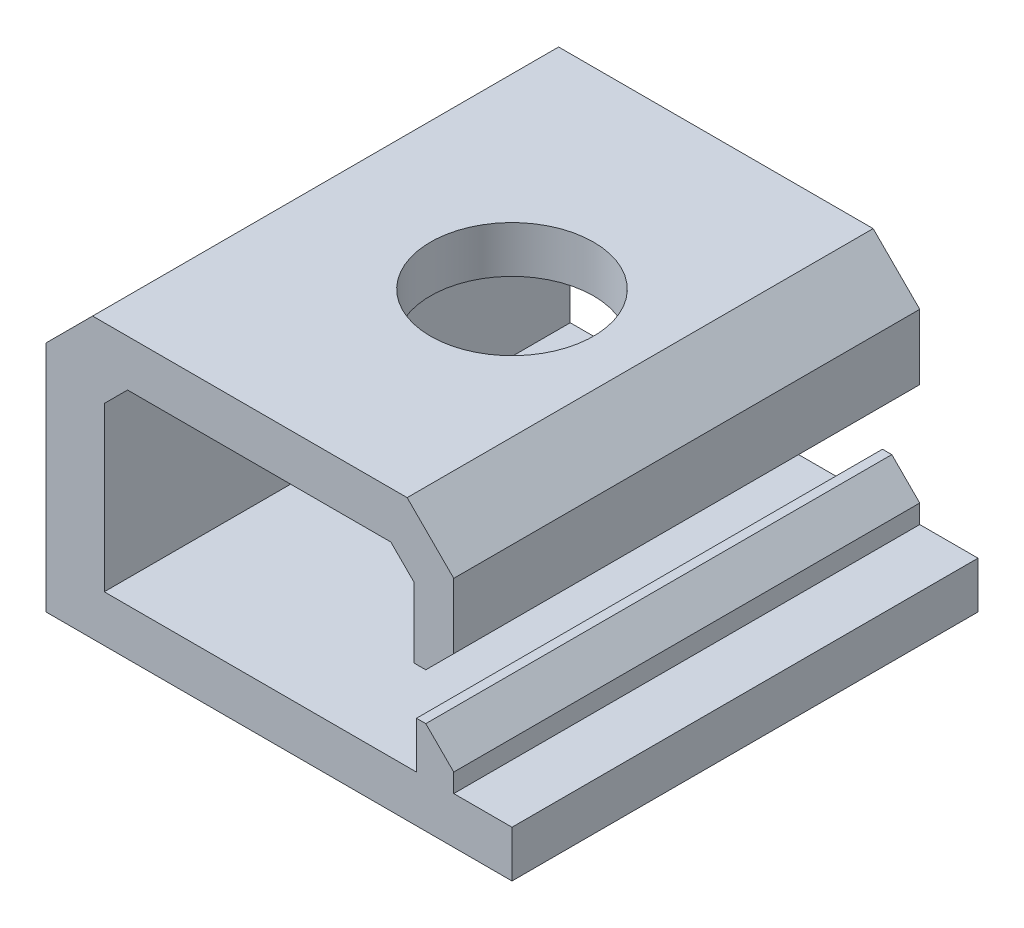
ISO-10303-21;
HEADER;
FILE_DESCRIPTION(('STEP AP214'),'2;1');
FILE_NAME('part.step','',(''),(''),'','','');
FILE_SCHEMA(('AUTOMOTIVE_DESIGN { 1 0 10303 214 1 1 1 1 }'));
ENDSEC;
DATA;
#1=APPLICATION_CONTEXT('core data for automotive mechanical design processes');
#2=APPLICATION_PROTOCOL_DEFINITION('international standard','automotive_design',2000,#1);
#3=PRODUCT_CONTEXT('',#1,'mechanical');
#4=PRODUCT('Part','Part','',(#3));
#5=PRODUCT_RELATED_PRODUCT_CATEGORY('part','',(#4));
#6=PRODUCT_DEFINITION_FORMATION('','',#4);
#7=PRODUCT_DEFINITION_CONTEXT('part definition',#1,'design');
#8=PRODUCT_DEFINITION('design','',#6,#7);
#9=PRODUCT_DEFINITION_SHAPE('','',#8);
#10=(LENGTH_UNIT() NAMED_UNIT(*) SI_UNIT(.MILLI.,.METRE.));
#11=(NAMED_UNIT(*) PLANE_ANGLE_UNIT() SI_UNIT($,.RADIAN.));
#12=(NAMED_UNIT(*) SI_UNIT($,.STERADIAN.) SOLID_ANGLE_UNIT());
#13=UNCERTAINTY_MEASURE_WITH_UNIT(LENGTH_MEASURE(1.E-05),#10,'distance_accuracy_value','');
#14=(GEOMETRIC_REPRESENTATION_CONTEXT(3) GLOBAL_UNCERTAINTY_ASSIGNED_CONTEXT((#13)) GLOBAL_UNIT_ASSIGNED_CONTEXT((#10,
#11,#12)) REPRESENTATION_CONTEXT('',''));
#15=CARTESIAN_POINT('',(0.,0.,0.));
#16=DIRECTION('',(0.,0.,1.));
#17=DIRECTION('',(1.,0.,0.));
#18=AXIS2_PLACEMENT_3D('',#15,#16,#17);
#19=CARTESIAN_POINT('',(0.,2.,0.));
#20=DIRECTION('',(0.,-1.,0.));
#21=DIRECTION('',(0.,0.,-1.));
#22=AXIS2_PLACEMENT_3D('',#19,#20,#21);
#23=PLANE('',#22);
#24=CARTESIAN_POINT('',(0.,2.,0.));
#25=DIRECTION('',(0.,1.,0.));
#26=DIRECTION('',(0.,0.,1.));
#27=AXIS2_PLACEMENT_3D('',#24,#25,#26);
#28=CIRCLE('',#27,1.75);
#29=CARTESIAN_POINT('',(0.,2.,1.75));
#30=VERTEX_POINT('',#29);
#31=EDGE_CURVE('E242',#30,#30,#28,.T.);
#32=ORIENTED_EDGE('',*,*,#31,.F.);
#33=EDGE_LOOP('',(#32));
#34=FACE_BOUND('',#33,.T.);
#35=DIRECTION('',(0.,0.,1.));
#36=VECTOR('',#35,1.);
#37=CARTESIAN_POINT('',(5.9,2.,10.));
#38=LINE('',#37,#36);
#39=CARTESIAN_POINT('',(5.9,2.,-10.));
#40=VERTEX_POINT('',#39);
#41=CARTESIAN_POINT('',(5.9,2.,10.));
#42=VERTEX_POINT('',#41);
#43=EDGE_CURVE('E190',#40,#42,#38,.T.);
#44=ORIENTED_EDGE('',*,*,#43,.F.);
#45=DIRECTION('',(-1.,0.,0.));
#46=VECTOR('',#45,1.);
#47=CARTESIAN_POINT('',(-10.,2.,-10.));
#48=LINE('',#47,#46);
#49=CARTESIAN_POINT('',(-7.5,2.,-10.));
#50=VERTEX_POINT('',#49);
#51=EDGE_CURVE('E251',#40,#50,#48,.T.);
#52=ORIENTED_EDGE('',*,*,#51,.T.);
#53=DIRECTION('',(0.,0.,-1.));
#54=VECTOR('',#53,1.);
#55=CARTESIAN_POINT('',(-7.5,2.,10.));
#56=LINE('',#55,#54);
#57=CARTESIAN_POINT('',(-7.5,2.,10.));
#58=VERTEX_POINT('',#57);
#59=EDGE_CURVE('E227',#58,#50,#56,.T.);
#60=ORIENTED_EDGE('',*,*,#59,.F.);
#61=DIRECTION('',(1.,0.,0.));
#62=VECTOR('',#61,1.);
#63=CARTESIAN_POINT('',(-10.,2.,10.));
#64=LINE('',#63,#62);
#65=EDGE_CURVE('E257',#58,#42,#64,.T.);
#66=ORIENTED_EDGE('',*,*,#65,.T.);
#67=EDGE_LOOP('',(#44,#52,#60,#66));
#68=FACE_BOUND('',#67,.T.);
#69=ADVANCED_FACE('F33',(#34,#68),#23,.F.);
#70=DIRECTION('',(0.,0.,-1.));
#71=VECTOR('',#70,1.);
#72=CARTESIAN_POINT('',(7.5,2.,10.));
#73=LINE('',#72,#71);
#74=CARTESIAN_POINT('',(7.5,2.,10.));
#75=VERTEX_POINT('',#74);
#76=CARTESIAN_POINT('',(7.5,2.,-10.));
#77=VERTEX_POINT('',#76);
#78=EDGE_CURVE('E187',#75,#77,#73,.T.);
#79=ORIENTED_EDGE('',*,*,#78,.F.);
#80=CARTESIAN_POINT('',(10.,2.,10.));
#81=VERTEX_POINT('',#80);
#82=EDGE_CURVE('E256',#75,#81,#64,.T.);
#83=ORIENTED_EDGE('',*,*,#82,.T.);
#84=DIRECTION('',(0.,0.,-1.));
#85=VECTOR('',#84,1.);
#86=CARTESIAN_POINT('',(10.,2.,10.));
#87=LINE('',#86,#85);
#88=CARTESIAN_POINT('',(10.,2.,-10.));
#89=VERTEX_POINT('',#88);
#90=EDGE_CURVE('E248',#81,#89,#87,.T.);
#91=ORIENTED_EDGE('',*,*,#90,.T.);
#92=EDGE_CURVE('E253',#89,#77,#48,.T.);
#93=ORIENTED_EDGE('',*,*,#92,.T.);
#94=EDGE_LOOP('',(#79,#83,#91,#93));
#95=FACE_BOUND('',#94,.T.);
#96=ADVANCED_FACE('F337',(#95),#23,.F.);
#97=CARTESIAN_POINT('',(7.5,10.,-10.));
#98=DIRECTION('',(0.,1.,0.));
#99=DIRECTION('',(0.,0.,1.));
#100=AXIS2_PLACEMENT_3D('',#97,#98,#99);
#101=PLANE('',#100);
#102=CARTESIAN_POINT('',(0.,10.,0.));
#103=DIRECTION('',(0.,1.,0.));
#104=DIRECTION('',(0.,0.,1.));
#105=AXIS2_PLACEMENT_3D('',#102,#103,#104);
#106=CIRCLE('',#105,3.5);
#107=CARTESIAN_POINT('',(0.,10.,3.5));
#108=VERTEX_POINT('',#107);
#109=EDGE_CURVE('E195',#108,#108,#106,.T.);
#110=ORIENTED_EDGE('',*,*,#109,.T.);
#111=EDGE_LOOP('',(#110));
#112=FACE_BOUND('',#111,.T.);
#113=DIRECTION('',(-1.,0.,0.));
#114=VECTOR('',#113,1.);
#115=CARTESIAN_POINT('',(7.5,10.,-10.));
#116=LINE('',#115,#114);
#117=CARTESIAN_POINT('',(4.80000000000001,10.,-10.));
#118=VERTEX_POINT('',#117);
#119=CARTESIAN_POINT('',(-6.5,10.,-10.));
#120=VERTEX_POINT('',#119);
#121=EDGE_CURVE('E221',#118,#120,#116,.T.);
#122=ORIENTED_EDGE('',*,*,#121,.F.);
#123=DIRECTION('',(0.,0.,1.));
#124=VECTOR('',#123,1.);
#125=CARTESIAN_POINT('',(4.8,10.,10.));
#126=LINE('',#125,#124);
#127=CARTESIAN_POINT('',(4.8,10.,10.));
#128=VERTEX_POINT('',#127);
#129=EDGE_CURVE('E312',#118,#128,#126,.T.);
#130=ORIENTED_EDGE('',*,*,#129,.T.);
#131=DIRECTION('',(-1.,0.,0.));
#132=VECTOR('',#131,1.);
#133=CARTESIAN_POINT('',(7.5,10.,10.));
#134=LINE('',#133,#132);
#135=CARTESIAN_POINT('',(-6.5,10.,10.));
#136=VERTEX_POINT('',#135);
#137=EDGE_CURVE('E224',#128,#136,#134,.T.);
#138=ORIENTED_EDGE('',*,*,#137,.T.);
#139=DIRECTION('',(0.,0.,-1.));
#140=VECTOR('',#139,1.);
#141=CARTESIAN_POINT('',(-6.5,10.,-10.));
#142=LINE('',#141,#140);
#143=EDGE_CURVE('E309',#136,#120,#142,.T.);
#144=ORIENTED_EDGE('',*,*,#143,.T.);
#145=EDGE_LOOP('',(#122,#130,#138,#144));
#146=FACE_BOUND('',#145,.T.);
#147=ADVANCED_FACE('F392',(#112,#146),#101,.F.);
#148=CARTESIAN_POINT('',(-7.5,12.,10.));
#149=DIRECTION('',(-1.,0.,0.));
#150=DIRECTION('',(0.,0.,1.));
#151=AXIS2_PLACEMENT_3D('',#148,#149,#150);
#152=PLANE('',#151);
#153=DIRECTION('',(0.,-1.,0.));
#154=VECTOR('',#153,1.);
#155=CARTESIAN_POINT('',(-7.5,12.,-10.));
#156=LINE('',#155,#154);
#157=CARTESIAN_POINT('',(-7.5,9.00000000000001,-10.));
#158=VERTEX_POINT('',#157);
#159=EDGE_CURVE('E234',#158,#50,#156,.T.);
#160=ORIENTED_EDGE('',*,*,#159,.F.);
#161=DIRECTION('',(0.,0.,1.));
#162=VECTOR('',#161,1.);
#163=CARTESIAN_POINT('',(-7.5,9.00000000000001,10.));
#164=LINE('',#163,#162);
#165=CARTESIAN_POINT('',(-7.5,9.00000000000001,10.));
#166=VERTEX_POINT('',#165);
#167=EDGE_CURVE('E314',#158,#166,#164,.T.);
#168=ORIENTED_EDGE('',*,*,#167,.T.);
#169=DIRECTION('',(0.,-1.,0.));
#170=VECTOR('',#169,1.);
#171=CARTESIAN_POINT('',(-7.5,12.,10.));
#172=LINE('',#171,#170);
#173=EDGE_CURVE('E239',#166,#58,#172,.T.);
#174=ORIENTED_EDGE('',*,*,#173,.T.);
#175=ORIENTED_EDGE('',*,*,#59,.T.);
#176=EDGE_LOOP('',(#160,#168,#174,#175));
#177=FACE_BOUND('',#176,.T.);
#178=ADVANCED_FACE('F404',(#177),#152,.F.);
#179=CARTESIAN_POINT('',(0.,0.,0.));
#180=DIRECTION('',(0.,-1.,0.));
#181=DIRECTION('',(0.,0.,-1.));
#182=AXIS2_PLACEMENT_3D('',#179,#180,#181);
#183=PLANE('',#182);
#184=DIRECTION('',(0.,0.,-1.));
#185=VECTOR('',#184,1.);
#186=CARTESIAN_POINT('',(10.,0.,10.));
#187=LINE('',#186,#185);
#188=CARTESIAN_POINT('',(10.,0.,10.));
#189=VERTEX_POINT('',#188);
#190=CARTESIAN_POINT('',(10.,0.,-10.));
#191=VERTEX_POINT('',#190);
#192=EDGE_CURVE('E245',#189,#191,#187,.T.);
#193=ORIENTED_EDGE('',*,*,#192,.F.);
#194=DIRECTION('',(1.,0.,0.));
#195=VECTOR('',#194,1.);
#196=CARTESIAN_POINT('',(-10.,0.,10.));
#197=LINE('',#196,#195);
#198=CARTESIAN_POINT('',(-10.,0.,10.));
#199=VERTEX_POINT('',#198);
#200=EDGE_CURVE('E252',#199,#189,#197,.T.);
#201=ORIENTED_EDGE('',*,*,#200,.F.);
#202=DIRECTION('',(0.,0.,1.));
#203=VECTOR('',#202,1.);
#204=CARTESIAN_POINT('',(-10.,0.,10.));
#205=LINE('',#204,#203);
#206=CARTESIAN_POINT('',(-10.,0.,-10.));
#207=VERTEX_POINT('',#206);
#208=EDGE_CURVE('E265',#207,#199,#205,.T.);
#209=ORIENTED_EDGE('',*,*,#208,.F.);
#210=DIRECTION('',(-1.,0.,0.));
#211=VECTOR('',#210,1.);
#212=CARTESIAN_POINT('',(-10.,0.,-10.));
#213=LINE('',#212,#211);
#214=EDGE_CURVE('E262',#191,#207,#213,.T.);
#215=ORIENTED_EDGE('',*,*,#214,.F.);
#216=EDGE_LOOP('',(#193,#201,#209,#215));
#217=FACE_BOUND('',#216,.T.);
#218=CARTESIAN_POINT('',(0.,0.,0.));
#219=DIRECTION('',(0.,1.,0.));
#220=DIRECTION('',(0.,0.,1.));
#221=AXIS2_PLACEMENT_3D('',#218,#219,#220);
#222=CIRCLE('',#221,1.75);
#223=CARTESIAN_POINT('',(0.,0.,1.75));
#224=VERTEX_POINT('',#223);
#225=EDGE_CURVE('E241',#224,#224,#222,.T.);
#226=ORIENTED_EDGE('',*,*,#225,.T.);
#227=EDGE_LOOP('',(#226));
#228=FACE_BOUND('',#227,.T.);
#229=ADVANCED_FACE('F351',(#217,#228),#183,.T.);
#230=CARTESIAN_POINT('',(10.,2.,10.));
#231=DIRECTION('',(-1.,0.,0.));
#232=DIRECTION('',(0.,0.,1.));
#233=AXIS2_PLACEMENT_3D('',#230,#231,#232);
#234=PLANE('',#233);
#235=ORIENTED_EDGE('',*,*,#192,.T.);
#236=DIRECTION('',(0.,-1.,0.));
#237=VECTOR('',#236,1.);
#238=CARTESIAN_POINT('',(10.,2.,-10.));
#239=LINE('',#238,#237);
#240=EDGE_CURVE('E275',#89,#191,#239,.T.);
#241=ORIENTED_EDGE('',*,*,#240,.F.);
#242=ORIENTED_EDGE('',*,*,#90,.F.);
#243=DIRECTION('',(0.,-1.,0.));
#244=VECTOR('',#243,1.);
#245=CARTESIAN_POINT('',(10.,2.,10.));
#246=LINE('',#245,#244);
#247=EDGE_CURVE('E259',#81,#189,#246,.T.);
#248=ORIENTED_EDGE('',*,*,#247,.T.);
#249=EDGE_LOOP('',(#235,#241,#242,#248));
#250=FACE_BOUND('',#249,.T.);
#251=ADVANCED_FACE('F346',(#250),#234,.F.);
#252=CARTESIAN_POINT('',(-10.,2.,-10.));
#253=DIRECTION('',(0.,0.,1.));
#254=DIRECTION('',(1.,0.,0.));
#255=AXIS2_PLACEMENT_3D('',#252,#253,#254);
#256=PLANE('',#255);
#257=DIRECTION('',(-1.,0.,0.));
#258=VECTOR('',#257,1.);
#259=CARTESIAN_POINT('',(5.9,4.,-10.));
#260=LINE('',#259,#258);
#261=CARTESIAN_POINT('',(6.3,4.,-10.));
#262=VERTEX_POINT('',#261);
#263=CARTESIAN_POINT('',(5.9,4.,-10.));
#264=VERTEX_POINT('',#263);
#265=EDGE_CURVE('E179',#262,#264,#260,.T.);
#266=ORIENTED_EDGE('',*,*,#265,.F.);
#267=DIRECTION('',(-0.707106781186547,0.707106781186549,0.));
#268=VECTOR('',#267,1.);
#269=CARTESIAN_POINT('',(6.3,4.,-10.));
#270=LINE('',#269,#268);
#271=CARTESIAN_POINT('',(7.5,2.79999999999999,-10.));
#272=VERTEX_POINT('',#271);
#273=EDGE_CURVE('E55',#262,#272,#270,.F.);
#274=ORIENTED_EDGE('',*,*,#273,.T.);
#275=DIRECTION('',(0.,-1.,0.));
#276=VECTOR('',#275,1.);
#277=CARTESIAN_POINT('',(7.5,4.,-10.));
#278=LINE('',#277,#276);
#279=EDGE_CURVE('E197',#272,#77,#278,.T.);
#280=ORIENTED_EDGE('',*,*,#279,.T.);
#281=ORIENTED_EDGE('',*,*,#92,.F.);
#282=ORIENTED_EDGE('',*,*,#240,.T.);
#283=ORIENTED_EDGE('',*,*,#214,.T.);
#284=DIRECTION('',(0.,-1.,0.));
#285=VECTOR('',#284,1.);
#286=CARTESIAN_POINT('',(-10.,2.,-10.));
#287=LINE('',#286,#285);
#288=CARTESIAN_POINT('',(-10.,9.99999999999998,-10.));
#289=VERTEX_POINT('',#288);
#290=EDGE_CURVE('E273',#289,#207,#287,.T.);
#291=ORIENTED_EDGE('',*,*,#290,.F.);
#292=DIRECTION('',(-0.707106781186546,-0.707106781186549,0.));
#293=VECTOR('',#292,1.);
#294=CARTESIAN_POINT('',(-7.99999999999999,12.,-10.));
#295=LINE('',#294,#293);
#296=CARTESIAN_POINT('',(-7.99999999999999,12.,-10.));
#297=VERTEX_POINT('',#296);
#298=EDGE_CURVE('E300',#289,#297,#295,.F.);
#299=ORIENTED_EDGE('',*,*,#298,.T.);
#300=DIRECTION('',(-1.,0.,0.));
#301=VECTOR('',#300,1.);
#302=CARTESIAN_POINT('',(-10.,12.,-10.));
#303=LINE('',#302,#301);
#304=CARTESIAN_POINT('',(5.49999999999999,12.,-10.));
#305=VERTEX_POINT('',#304);
#306=EDGE_CURVE('E231',#305,#297,#303,.T.);
#307=ORIENTED_EDGE('',*,*,#306,.F.);
#308=DIRECTION('',(-0.707106781186549,0.707106781186546,0.));
#309=VECTOR('',#308,1.);
#310=CARTESIAN_POINT('',(7.5,9.99999999999999,-10.));
#311=LINE('',#310,#309);
#312=CARTESIAN_POINT('',(7.5,9.99999999999999,-10.));
#313=VERTEX_POINT('',#312);
#314=EDGE_CURVE('E302',#305,#313,#311,.F.);
#315=ORIENTED_EDGE('',*,*,#314,.T.);
#316=DIRECTION('',(0.,1.,0.));
#317=VECTOR('',#316,1.);
#318=CARTESIAN_POINT('',(7.5,12.,-10.));
#319=LINE('',#318,#317);
#320=CARTESIAN_POINT('',(7.5,7.20000000000001,-10.));
#321=VERTEX_POINT('',#320);
#322=EDGE_CURVE('E216',#321,#313,#319,.T.);
#323=ORIENTED_EDGE('',*,*,#322,.F.);
#324=DIRECTION('',(0.707106781186547,0.707106781186549,0.));
#325=VECTOR('',#324,1.);
#326=CARTESIAN_POINT('',(6.3,6.,-10.));
#327=LINE('',#326,#325);
#328=CARTESIAN_POINT('',(6.3,6.,-10.));
#329=VERTEX_POINT('',#328);
#330=EDGE_CURVE('E286',#321,#329,#327,.F.);
#331=ORIENTED_EDGE('',*,*,#330,.T.);
#332=DIRECTION('',(1.,0.,0.));
#333=VECTOR('',#332,1.);
#334=CARTESIAN_POINT('',(7.5,6.,-10.));
#335=LINE('',#334,#333);
#336=CARTESIAN_POINT('',(5.8,6.,-10.));
#337=VERTEX_POINT('',#336);
#338=EDGE_CURVE('E207',#337,#329,#335,.T.);
#339=ORIENTED_EDGE('',*,*,#338,.F.);
#340=DIRECTION('',(0.,1.,0.));
#341=VECTOR('',#340,1.);
#342=CARTESIAN_POINT('',(5.8,6.,-10.));
#343=LINE('',#342,#341);
#344=CARTESIAN_POINT('',(5.8,8.99999999999999,-10.));
#345=VERTEX_POINT('',#344);
#346=EDGE_CURVE('E210',#337,#345,#343,.T.);
#347=ORIENTED_EDGE('',*,*,#346,.T.);
#348=DIRECTION('',(0.707106781186544,-0.707106781186551,0.));
#349=VECTOR('',#348,1.);
#350=CARTESIAN_POINT('',(1.40000000000008,13.4,-10.));
#351=LINE('',#350,#349);
#352=EDGE_CURVE('E316',#345,#118,#351,.F.);
#353=ORIENTED_EDGE('',*,*,#352,.T.);
#354=ORIENTED_EDGE('',*,*,#121,.T.);
#355=DIRECTION('',(0.707106781186551,0.707106781186544,0.));
#356=VECTOR('',#355,1.);
#357=CARTESIAN_POINT('',(-12.25,4.25000000000004,-10.));
#358=LINE('',#357,#356);
#359=EDGE_CURVE('E320',#120,#158,#358,.F.);
#360=ORIENTED_EDGE('',*,*,#359,.T.);
#361=ORIENTED_EDGE('',*,*,#159,.T.);
#362=ORIENTED_EDGE('',*,*,#51,.F.);
#363=DIRECTION('',(0.,-1.,0.));
#364=VECTOR('',#363,1.);
#365=CARTESIAN_POINT('',(5.9,4.,-10.));
#366=LINE('',#365,#364);
#367=EDGE_CURVE('E329',#264,#40,#366,.T.);
#368=ORIENTED_EDGE('',*,*,#367,.F.);
#369=EDGE_LOOP('',(#266,#274,#280,#281,#282,#283,#291,#299,#307,#315,#323,#331,#339,#347,#353,
#354,#360,#361,#362,#368));
#370=FACE_BOUND('',#369,.T.);
#371=ADVANCED_FACE('F327',(#370),#256,.F.);
#372=CARTESIAN_POINT('',(-10.,2.,10.));
#373=DIRECTION('',(1.,0.,0.));
#374=DIRECTION('',(0.,0.,-1.));
#375=AXIS2_PLACEMENT_3D('',#372,#373,#374);
#376=PLANE('',#375);
#377=DIRECTION('',(0.,-1.,0.));
#378=VECTOR('',#377,1.);
#379=CARTESIAN_POINT('',(-10.,2.,10.));
#380=LINE('',#379,#378);
#381=CARTESIAN_POINT('',(-10.,9.99999999999998,10.));
#382=VERTEX_POINT('',#381);
#383=EDGE_CURVE('E271',#382,#199,#380,.T.);
#384=ORIENTED_EDGE('',*,*,#383,.F.);
#385=DIRECTION('',(0.,0.,-1.));
#386=VECTOR('',#385,1.);
#387=CARTESIAN_POINT('',(-10.,9.99999999999998,10.));
#388=LINE('',#387,#386);
#389=EDGE_CURVE('E304',#382,#289,#388,.T.);
#390=ORIENTED_EDGE('',*,*,#389,.T.);
#391=ORIENTED_EDGE('',*,*,#290,.T.);
#392=ORIENTED_EDGE('',*,*,#208,.T.);
#393=EDGE_LOOP('',(#384,#390,#391,#392));
#394=FACE_BOUND('',#393,.T.);
#395=ADVANCED_FACE('F355',(#394),#376,.F.);
#396=CARTESIAN_POINT('',(-10.,2.,10.));
#397=DIRECTION('',(0.,0.,-1.));
#398=DIRECTION('',(-1.,0.,0.));
#399=AXIS2_PLACEMENT_3D('',#396,#397,#398);
#400=PLANE('',#399);
#401=DIRECTION('',(0.,-1.,0.));
#402=VECTOR('',#401,1.);
#403=CARTESIAN_POINT('',(7.5,4.,10.));
#404=LINE('',#403,#402);
#405=CARTESIAN_POINT('',(7.5,2.79999999999999,10.));
#406=VERTEX_POINT('',#405);
#407=EDGE_CURVE('E192',#406,#75,#404,.T.);
#408=ORIENTED_EDGE('',*,*,#407,.F.);
#409=DIRECTION('',(0.707106781186547,-0.707106781186549,0.));
#410=VECTOR('',#409,1.);
#411=CARTESIAN_POINT('',(6.3,4.,10.));
#412=LINE('',#411,#410);
#413=CARTESIAN_POINT('',(6.3,4.,10.));
#414=VERTEX_POINT('',#413);
#415=EDGE_CURVE('E11',#406,#414,#412,.F.);
#416=ORIENTED_EDGE('',*,*,#415,.T.);
#417=DIRECTION('',(1.,0.,0.));
#418=VECTOR('',#417,1.);
#419=CARTESIAN_POINT('',(5.9,4.,10.));
#420=LINE('',#419,#418);
#421=CARTESIAN_POINT('',(5.9,4.,10.));
#422=VERTEX_POINT('',#421);
#423=EDGE_CURVE('E168',#422,#414,#420,.T.);
#424=ORIENTED_EDGE('',*,*,#423,.F.);
#425=DIRECTION('',(0.,-1.,0.));
#426=VECTOR('',#425,1.);
#427=CARTESIAN_POINT('',(5.9,4.,10.));
#428=LINE('',#427,#426);
#429=EDGE_CURVE('E173',#422,#42,#428,.T.);
#430=ORIENTED_EDGE('',*,*,#429,.T.);
#431=ORIENTED_EDGE('',*,*,#65,.F.);
#432=ORIENTED_EDGE('',*,*,#173,.F.);
#433=DIRECTION('',(-0.707106781186551,-0.707106781186544,0.));
#434=VECTOR('',#433,1.);
#435=CARTESIAN_POINT('',(-12.25,4.25000000000004,10.));
#436=LINE('',#435,#434);
#437=EDGE_CURVE('E322',#166,#136,#436,.F.);
#438=ORIENTED_EDGE('',*,*,#437,.T.);
#439=ORIENTED_EDGE('',*,*,#137,.F.);
#440=DIRECTION('',(-0.707106781186544,0.707106781186551,0.));
#441=VECTOR('',#440,1.);
#442=CARTESIAN_POINT('',(1.40000000000008,13.4,10.));
#443=LINE('',#442,#441);
#444=CARTESIAN_POINT('',(5.8,8.99999999999999,10.));
#445=VERTEX_POINT('',#444);
#446=EDGE_CURVE('E318',#128,#445,#443,.F.);
#447=ORIENTED_EDGE('',*,*,#446,.T.);
#448=DIRECTION('',(0.,1.,0.));
#449=VECTOR('',#448,1.);
#450=CARTESIAN_POINT('',(5.8,6.,10.));
#451=LINE('',#450,#449);
#452=CARTESIAN_POINT('',(5.8,6.,10.));
#453=VERTEX_POINT('',#452);
#454=EDGE_CURVE('E213',#453,#445,#451,.T.);
#455=ORIENTED_EDGE('',*,*,#454,.F.);
#456=DIRECTION('',(-1.,0.,0.));
#457=VECTOR('',#456,1.);
#458=CARTESIAN_POINT('',(7.5,6.,10.));
#459=LINE('',#458,#457);
#460=CARTESIAN_POINT('',(6.3,6.,10.));
#461=VERTEX_POINT('',#460);
#462=EDGE_CURVE('E202',#461,#453,#459,.T.);
#463=ORIENTED_EDGE('',*,*,#462,.F.);
#464=DIRECTION('',(-0.707106781186547,-0.707106781186549,0.));
#465=VECTOR('',#464,1.);
#466=CARTESIAN_POINT('',(6.3,6.,10.));
#467=LINE('',#466,#465);
#468=CARTESIAN_POINT('',(7.5,7.2,10.));
#469=VERTEX_POINT('',#468);
#470=EDGE_CURVE('E281',#461,#469,#467,.F.);
#471=ORIENTED_EDGE('',*,*,#470,.T.);
#472=DIRECTION('',(0.,-1.,0.));
#473=VECTOR('',#472,1.);
#474=CARTESIAN_POINT('',(7.5,12.,10.));
#475=LINE('',#474,#473);
#476=CARTESIAN_POINT('',(7.5,9.99999999999999,10.));
#477=VERTEX_POINT('',#476);
#478=EDGE_CURVE('E219',#477,#469,#475,.T.);
#479=ORIENTED_EDGE('',*,*,#478,.F.);
#480=DIRECTION('',(0.707106781186549,-0.707106781186546,0.));
#481=VECTOR('',#480,1.);
#482=CARTESIAN_POINT('',(7.5,9.99999999999999,10.));
#483=LINE('',#482,#481);
#484=CARTESIAN_POINT('',(5.49999999999999,12.,10.));
#485=VERTEX_POINT('',#484);
#486=EDGE_CURVE('E293',#477,#485,#483,.F.);
#487=ORIENTED_EDGE('',*,*,#486,.T.);
#488=DIRECTION('',(1.,0.,0.));
#489=VECTOR('',#488,1.);
#490=CARTESIAN_POINT('',(-10.,12.,10.));
#491=LINE('',#490,#489);
#492=CARTESIAN_POINT('',(-7.99999999999999,12.,10.));
#493=VERTEX_POINT('',#492);
#494=EDGE_CURVE('E228',#493,#485,#491,.T.);
#495=ORIENTED_EDGE('',*,*,#494,.F.);
#496=DIRECTION('',(0.707106781186546,0.707106781186549,0.));
#497=VECTOR('',#496,1.);
#498=CARTESIAN_POINT('',(-7.99999999999999,12.,10.));
#499=LINE('',#498,#497);
#500=EDGE_CURVE('E291',#493,#382,#499,.F.);
#501=ORIENTED_EDGE('',*,*,#500,.T.);
#502=ORIENTED_EDGE('',*,*,#383,.T.);
#503=ORIENTED_EDGE('',*,*,#200,.T.);
#504=ORIENTED_EDGE('',*,*,#247,.F.);
#505=ORIENTED_EDGE('',*,*,#82,.F.);
#506=EDGE_LOOP('',(#408,#416,#424,#430,#431,#432,#438,#439,#447,#455,#463,#471,#479,#487,#495,
#501,#502,#503,#504,#505));
#507=FACE_BOUND('',#506,.T.);
#508=ADVANCED_FACE('F170',(#507),#400,.F.);
#509=CARTESIAN_POINT('',(0.,2.,0.));
#510=DIRECTION('',(0.,-1.,0.));
#511=DIRECTION('',(0.,0.,-1.));
#512=AXIS2_PLACEMENT_3D('',#509,#510,#511);
#513=CYLINDRICAL_SURFACE('',#512,1.75);
#514=ORIENTED_EDGE('',*,*,#31,.T.);
#515=EDGE_LOOP('',(#514));
#516=FACE_BOUND('',#515,.T.);
#517=ORIENTED_EDGE('',*,*,#225,.F.);
#518=EDGE_LOOP('',(#517));
#519=FACE_BOUND('',#518,.T.);
#520=ADVANCED_FACE('F416',(#516,#519),#513,.F.);
#521=CARTESIAN_POINT('',(0.,12.,0.));
#522=DIRECTION('',(0.,-1.,0.));
#523=DIRECTION('',(0.,0.,-1.));
#524=AXIS2_PLACEMENT_3D('',#521,#522,#523);
#525=PLANE('',#524);
#526=CARTESIAN_POINT('',(0.,12.,0.));
#527=DIRECTION('',(0.,1.,0.));
#528=DIRECTION('',(0.,0.,1.));
#529=AXIS2_PLACEMENT_3D('',#526,#527,#528);
#530=CIRCLE('',#529,3.5);
#531=CARTESIAN_POINT('',(0.,12.,3.5));
#532=VERTEX_POINT('',#531);
#533=EDGE_CURVE('E191',#532,#532,#530,.T.);
#534=ORIENTED_EDGE('',*,*,#533,.F.);
#535=EDGE_LOOP('',(#534));
#536=FACE_BOUND('',#535,.T.);
#537=ORIENTED_EDGE('',*,*,#494,.T.);
#538=DIRECTION('',(0.,0.,-1.));
#539=VECTOR('',#538,1.);
#540=CARTESIAN_POINT('',(5.49999999999999,12.,0.));
#541=LINE('',#540,#539);
#542=EDGE_CURVE('E298',#485,#305,#541,.T.);
#543=ORIENTED_EDGE('',*,*,#542,.T.);
#544=ORIENTED_EDGE('',*,*,#306,.T.);
#545=DIRECTION('',(0.,0.,1.));
#546=VECTOR('',#545,1.);
#547=CARTESIAN_POINT('',(-7.99999999999999,12.,0.));
#548=LINE('',#547,#546);
#549=EDGE_CURVE('E295',#297,#493,#548,.T.);
#550=ORIENTED_EDGE('',*,*,#549,.T.);
#551=EDGE_LOOP('',(#537,#543,#544,#550));
#552=FACE_BOUND('',#551,.T.);
#553=ADVANCED_FACE('F363',(#536,#552),#525,.F.);
#554=CARTESIAN_POINT('',(7.5,0.,0.));
#555=DIRECTION('',(-1.,0.,0.));
#556=DIRECTION('',(0.,0.,1.));
#557=AXIS2_PLACEMENT_3D('',#554,#555,#556);
#558=PLANE('',#557);
#559=ORIENTED_EDGE('',*,*,#322,.T.);
#560=DIRECTION('',(0.,0.,1.));
#561=VECTOR('',#560,1.);
#562=CARTESIAN_POINT('',(7.5,9.99999999999999,0.));
#563=LINE('',#562,#561);
#564=EDGE_CURVE('E288',#313,#477,#563,.T.);
#565=ORIENTED_EDGE('',*,*,#564,.T.);
#566=ORIENTED_EDGE('',*,*,#478,.T.);
#567=DIRECTION('',(0.,0.,-1.));
#568=VECTOR('',#567,1.);
#569=CARTESIAN_POINT('',(7.5,7.20000000000001,0.));
#570=LINE('',#569,#568);
#571=EDGE_CURVE('E284',#469,#321,#570,.T.);
#572=ORIENTED_EDGE('',*,*,#571,.T.);
#573=EDGE_LOOP('',(#559,#565,#566,#572));
#574=FACE_BOUND('',#573,.T.);
#575=ADVANCED_FACE('F372',(#574),#558,.F.);
#576=CARTESIAN_POINT('',(5.8,6.,10.));
#577=DIRECTION('',(1.,0.,0.));
#578=DIRECTION('',(0.,0.,-1.));
#579=AXIS2_PLACEMENT_3D('',#576,#577,#578);
#580=PLANE('',#579);
#581=ORIENTED_EDGE('',*,*,#454,.T.);
#582=DIRECTION('',(0.,0.,-1.));
#583=VECTOR('',#582,1.);
#584=CARTESIAN_POINT('',(5.8,8.99999999999999,-10.));
#585=LINE('',#584,#583);
#586=EDGE_CURVE('E306',#445,#345,#585,.T.);
#587=ORIENTED_EDGE('',*,*,#586,.T.);
#588=ORIENTED_EDGE('',*,*,#346,.F.);
#589=DIRECTION('',(0.,0.,-1.));
#590=VECTOR('',#589,1.);
#591=CARTESIAN_POINT('',(5.8,6.,10.));
#592=LINE('',#591,#590);
#593=EDGE_CURVE('E205',#453,#337,#592,.T.);
#594=ORIENTED_EDGE('',*,*,#593,.F.);
#595=EDGE_LOOP('',(#581,#587,#588,#594));
#596=FACE_BOUND('',#595,.T.);
#597=ADVANCED_FACE('F386',(#596),#580,.F.);
#598=CARTESIAN_POINT('',(0.,6.,0.));
#599=DIRECTION('',(0.,1.,0.));
#600=DIRECTION('',(0.,0.,1.));
#601=AXIS2_PLACEMENT_3D('',#598,#599,#600);
#602=PLANE('',#601);
#603=ORIENTED_EDGE('',*,*,#338,.T.);
#604=DIRECTION('',(0.,0.,1.));
#605=VECTOR('',#604,1.);
#606=CARTESIAN_POINT('',(6.3,6.,0.));
#607=LINE('',#606,#605);
#608=EDGE_CURVE('E278',#329,#461,#607,.T.);
#609=ORIENTED_EDGE('',*,*,#608,.T.);
#610=ORIENTED_EDGE('',*,*,#462,.T.);
#611=ORIENTED_EDGE('',*,*,#593,.T.);
#612=EDGE_LOOP('',(#603,#609,#610,#611));
#613=FACE_BOUND('',#612,.T.);
#614=ADVANCED_FACE('F380',(#613),#602,.F.);
#615=CARTESIAN_POINT('',(6.3,6.,0.));
#616=DIRECTION('',(-0.707106781186549,0.707106781186547,0.));
#617=DIRECTION('',(0.,0.,1.));
#618=AXIS2_PLACEMENT_3D('',#615,#616,#617);
#619=PLANE('',#618);
#620=ORIENTED_EDGE('',*,*,#330,.F.);
#621=ORIENTED_EDGE('',*,*,#571,.F.);
#622=ORIENTED_EDGE('',*,*,#470,.F.);
#623=ORIENTED_EDGE('',*,*,#608,.F.);
#624=EDGE_LOOP('',(#620,#621,#622,#623));
#625=FACE_BOUND('',#624,.T.);
#626=ADVANCED_FACE('F376',(#625),#619,.F.);
#627=CARTESIAN_POINT('',(7.5,9.99999999999999,0.));
#628=DIRECTION('',(-0.707106781186546,-0.707106781186549,0.));
#629=DIRECTION('',(0.,0.,1.));
#630=AXIS2_PLACEMENT_3D('',#627,#628,#629);
#631=PLANE('',#630);
#632=ORIENTED_EDGE('',*,*,#314,.F.);
#633=ORIENTED_EDGE('',*,*,#542,.F.);
#634=ORIENTED_EDGE('',*,*,#486,.F.);
#635=ORIENTED_EDGE('',*,*,#564,.F.);
#636=EDGE_LOOP('',(#632,#633,#634,#635));
#637=FACE_BOUND('',#636,.T.);
#638=ADVANCED_FACE('F367',(#637),#631,.F.);
#639=CARTESIAN_POINT('',(-7.99999999999999,12.,0.));
#640=DIRECTION('',(0.707106781186549,-0.707106781186546,0.));
#641=DIRECTION('',(0.,0.,1.));
#642=AXIS2_PLACEMENT_3D('',#639,#640,#641);
#643=PLANE('',#642);
#644=ORIENTED_EDGE('',*,*,#298,.F.);
#645=ORIENTED_EDGE('',*,*,#389,.F.);
#646=ORIENTED_EDGE('',*,*,#500,.F.);
#647=ORIENTED_EDGE('',*,*,#549,.F.);
#648=EDGE_LOOP('',(#644,#645,#646,#647));
#649=FACE_BOUND('',#648,.T.);
#650=ADVANCED_FACE('F358',(#649),#643,.F.);
#651=CARTESIAN_POINT('',(5.8,8.99999999999999,10.));
#652=DIRECTION('',(-0.707106781186551,-0.707106781186544,0.));
#653=DIRECTION('',(0.,0.,1.));
#654=AXIS2_PLACEMENT_3D('',#651,#652,#653);
#655=PLANE('',#654);
#656=ORIENTED_EDGE('',*,*,#446,.F.);
#657=ORIENTED_EDGE('',*,*,#129,.F.);
#658=ORIENTED_EDGE('',*,*,#352,.F.);
#659=ORIENTED_EDGE('',*,*,#586,.F.);
#660=EDGE_LOOP('',(#656,#657,#658,#659));
#661=FACE_BOUND('',#660,.T.);
#662=ADVANCED_FACE('F396',(#661),#655,.T.);
#663=CARTESIAN_POINT('',(-6.5,10.,-10.));
#664=DIRECTION('',(0.707106781186544,-0.707106781186551,0.));
#665=DIRECTION('',(0.,0.,1.));
#666=AXIS2_PLACEMENT_3D('',#663,#664,#665);
#667=PLANE('',#666);
#668=ORIENTED_EDGE('',*,*,#437,.F.);
#669=ORIENTED_EDGE('',*,*,#167,.F.);
#670=ORIENTED_EDGE('',*,*,#359,.F.);
#671=ORIENTED_EDGE('',*,*,#143,.F.);
#672=EDGE_LOOP('',(#668,#669,#670,#671));
#673=FACE_BOUND('',#672,.T.);
#674=ADVANCED_FACE('F400',(#673),#667,.T.);
#675=CARTESIAN_POINT('',(0.,10.,0.));
#676=DIRECTION('',(0.,1.,0.));
#677=DIRECTION('',(0.,0.,1.));
#678=AXIS2_PLACEMENT_3D('',#675,#676,#677);
#679=CYLINDRICAL_SURFACE('',#678,3.5);
#680=ORIENTED_EDGE('',*,*,#109,.F.);
#681=EDGE_LOOP('',(#680));
#682=FACE_BOUND('',#681,.T.);
#683=ORIENTED_EDGE('',*,*,#533,.T.);
#684=EDGE_LOOP('',(#683));
#685=FACE_BOUND('',#684,.T.);
#686=ADVANCED_FACE('F436',(#682,#685),#679,.F.);
#687=CARTESIAN_POINT('',(5.9,4.,10.));
#688=DIRECTION('',(1.,0.,0.));
#689=DIRECTION('',(0.,0.,-1.));
#690=AXIS2_PLACEMENT_3D('',#687,#688,#689);
#691=PLANE('',#690);
#692=ORIENTED_EDGE('',*,*,#43,.T.);
#693=ORIENTED_EDGE('',*,*,#429,.F.);
#694=DIRECTION('',(0.,0.,1.));
#695=VECTOR('',#694,1.);
#696=CARTESIAN_POINT('',(5.9,4.,10.));
#697=LINE('',#696,#695);
#698=EDGE_CURVE('E180',#264,#422,#697,.T.);
#699=ORIENTED_EDGE('',*,*,#698,.F.);
#700=ORIENTED_EDGE('',*,*,#367,.T.);
#701=EDGE_LOOP('',(#692,#693,#699,#700));
#702=FACE_BOUND('',#701,.T.);
#703=ADVANCED_FACE('F189',(#702),#691,.F.);
#704=CARTESIAN_POINT('',(7.5,4.,10.));
#705=DIRECTION('',(-1.,0.,0.));
#706=DIRECTION('',(0.,0.,1.));
#707=AXIS2_PLACEMENT_3D('',#704,#705,#706);
#708=PLANE('',#707);
#709=ORIENTED_EDGE('',*,*,#279,.F.);
#710=DIRECTION('',(0.,0.,1.));
#711=VECTOR('',#710,1.);
#712=CARTESIAN_POINT('',(7.5,2.79999999999999,10.));
#713=LINE('',#712,#711);
#714=EDGE_CURVE('E41',#272,#406,#713,.T.);
#715=ORIENTED_EDGE('',*,*,#714,.T.);
#716=ORIENTED_EDGE('',*,*,#407,.T.);
#717=ORIENTED_EDGE('',*,*,#78,.T.);
#718=EDGE_LOOP('',(#709,#715,#716,#717));
#719=FACE_BOUND('',#718,.T.);
#720=ADVANCED_FACE('F340',(#719),#708,.F.);
#721=CARTESIAN_POINT('',(0.,4.,0.));
#722=DIRECTION('',(0.,-1.,0.));
#723=DIRECTION('',(0.,0.,-1.));
#724=AXIS2_PLACEMENT_3D('',#721,#722,#723);
#725=PLANE('',#724);
#726=ORIENTED_EDGE('',*,*,#423,.T.);
#727=DIRECTION('',(0.,0.,-1.));
#728=VECTOR('',#727,1.);
#729=CARTESIAN_POINT('',(6.3,4.,0.));
#730=LINE('',#729,#728);
#731=EDGE_CURVE('E324',#414,#262,#730,.T.);
#732=ORIENTED_EDGE('',*,*,#731,.T.);
#733=ORIENTED_EDGE('',*,*,#265,.T.);
#734=ORIENTED_EDGE('',*,*,#698,.T.);
#735=EDGE_LOOP('',(#726,#732,#733,#734));
#736=FACE_BOUND('',#735,.T.);
#737=ADVANCED_FACE('F183',(#736),#725,.F.);
#738=CARTESIAN_POINT('',(6.3,4.,0.));
#739=DIRECTION('',(-0.707106781186549,-0.707106781186547,0.));
#740=DIRECTION('',(0.,0.,-1.));
#741=AXIS2_PLACEMENT_3D('',#738,#739,#740);
#742=PLANE('',#741);
#743=ORIENTED_EDGE('',*,*,#415,.F.);
#744=ORIENTED_EDGE('',*,*,#714,.F.);
#745=ORIENTED_EDGE('',*,*,#273,.F.);
#746=ORIENTED_EDGE('',*,*,#731,.F.);
#747=EDGE_LOOP('',(#743,#744,#745,#746));
#748=FACE_BOUND('',#747,.T.);
#749=ADVANCED_FACE('F35',(#748),#742,.F.);
#750=CLOSED_SHELL('',(#69,#96,#147,#178,#229,#251,#371,#395,#508,#520,#553,#575,#597,#614,#626,
#638,#650,#662,#674,#686,#703,#720,#737,#749));
#751=MANIFOLD_SOLID_BREP('B2',#750);
#752=ADVANCED_BREP_SHAPE_REPRESENTATION('',(#18,#751),#14);
#753=SHAPE_DEFINITION_REPRESENTATION(#9,#752);
ENDSEC;
END-ISO-10303-21;
